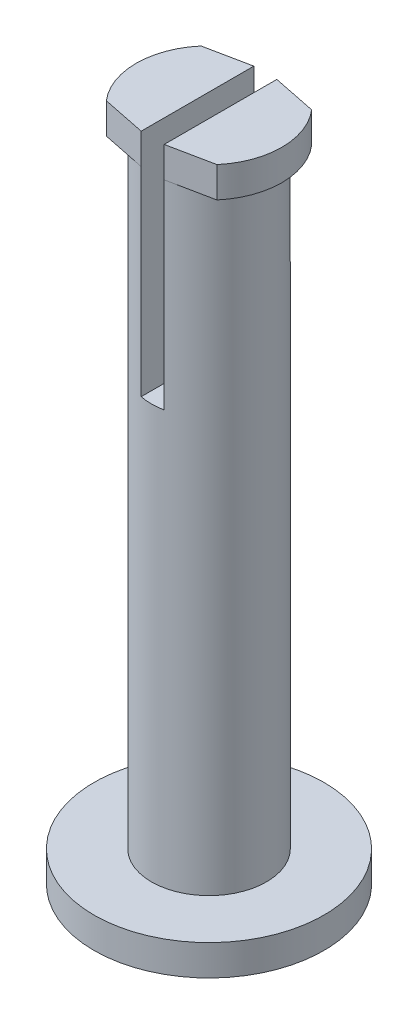
ISO-10303-21;
HEADER;
FILE_DESCRIPTION(('STEP AP214'),'2;1');
FILE_NAME('part.step','',(''),(''),'','','');
FILE_SCHEMA(('AUTOMOTIVE_DESIGN { 1 0 10303 214 1 1 1 1 }'));
ENDSEC;
DATA;
#1=APPLICATION_CONTEXT('core data for automotive mechanical design processes');
#2=APPLICATION_PROTOCOL_DEFINITION('international standard','automotive_design',2000,#1);
#3=PRODUCT_CONTEXT('',#1,'mechanical');
#4=PRODUCT('Part','Part','',(#3));
#5=PRODUCT_RELATED_PRODUCT_CATEGORY('part','',(#4));
#6=PRODUCT_DEFINITION_FORMATION('','',#4);
#7=PRODUCT_DEFINITION_CONTEXT('part definition',#1,'design');
#8=PRODUCT_DEFINITION('design','',#6,#7);
#9=PRODUCT_DEFINITION_SHAPE('','',#8);
#10=(LENGTH_UNIT() NAMED_UNIT(*) SI_UNIT(.MILLI.,.METRE.));
#11=(NAMED_UNIT(*) PLANE_ANGLE_UNIT() SI_UNIT($,.RADIAN.));
#12=(NAMED_UNIT(*) SI_UNIT($,.STERADIAN.) SOLID_ANGLE_UNIT());
#13=UNCERTAINTY_MEASURE_WITH_UNIT(LENGTH_MEASURE(1.E-05),#10,'distance_accuracy_value','');
#14=(GEOMETRIC_REPRESENTATION_CONTEXT(3) GLOBAL_UNCERTAINTY_ASSIGNED_CONTEXT((#13)) GLOBAL_UNIT_ASSIGNED_CONTEXT((#10,
#11,#12)) REPRESENTATION_CONTEXT('',''));
#15=CARTESIAN_POINT('',(0.,0.,0.));
#16=DIRECTION('',(0.,0.,1.));
#17=DIRECTION('',(1.,0.,0.));
#18=AXIS2_PLACEMENT_3D('',#15,#16,#17);
#19=CARTESIAN_POINT('',(0.,22.,0.));
#20=DIRECTION('',(0.,-1.,0.));
#21=DIRECTION('',(0.,0.,-1.));
#22=AXIS2_PLACEMENT_3D('',#19,#20,#21);
#23=CYLINDRICAL_SURFACE('',#22,2.375);
#24=CARTESIAN_POINT('',(0.,21.,0.));
#25=DIRECTION('',(0.,1.,0.));
#26=DIRECTION('',(0.,0.,1.));
#27=AXIS2_PLACEMENT_3D('',#24,#25,#26);
#28=CIRCLE('',#27,2.375);
#29=CARTESIAN_POINT('',(-1.80328568570857,21.,-1.54556971234512));
#30=VERTEX_POINT('',#29);
#31=CARTESIAN_POINT('',(-1.80328568570857,21.,1.54556971234512));
#32=VERTEX_POINT('',#31);
#33=EDGE_CURVE('E167',#30,#32,#28,.T.);
#34=ORIENTED_EDGE('',*,*,#33,.T.);
#35=DIRECTION('',(0.,1.,0.));
#36=VECTOR('',#35,1.);
#37=CARTESIAN_POINT('',(-1.80328568570857,12.,1.54556971234512));
#38=LINE('',#37,#36);
#39=CARTESIAN_POINT('',(-1.80328568570857,22.,1.54556971234512));
#40=VERTEX_POINT('',#39);
#41=EDGE_CURVE('E230',#32,#40,#38,.T.);
#42=ORIENTED_EDGE('',*,*,#41,.T.);
#43=CARTESIAN_POINT('',(0.,22.,0.));
#44=DIRECTION('',(0.,1.,0.));
#45=DIRECTION('',(0.,0.,1.));
#46=AXIS2_PLACEMENT_3D('',#43,#44,#45);
#47=CIRCLE('',#46,2.375);
#48=CARTESIAN_POINT('',(-1.80328568570857,22.,-1.54556971234512));
#49=VERTEX_POINT('',#48);
#50=EDGE_CURVE('E168',#49,#40,#47,.T.);
#51=ORIENTED_EDGE('',*,*,#50,.F.);
#52=DIRECTION('',(0.,1.,0.));
#53=VECTOR('',#52,1.);
#54=CARTESIAN_POINT('',(-1.80328568570857,12.,-1.54556971234512));
#55=LINE('',#54,#53);
#56=EDGE_CURVE('E141',#30,#49,#55,.T.);
#57=ORIENTED_EDGE('',*,*,#56,.F.);
#58=EDGE_LOOP('',(#34,#42,#51,#57));
#59=FACE_BOUND('',#58,.T.);
#60=ADVANCED_FACE('F45',(#59),#23,.T.);
#61=CARTESIAN_POINT('',(0.,22.,0.));
#62=DIRECTION('',(0.,1.,0.));
#63=DIRECTION('',(0.,0.,1.));
#64=AXIS2_PLACEMENT_3D('',#61,#62,#63);
#65=PLANE('',#64);
#66=DIRECTION('',(-0.979795897113271,0.,-0.2));
#67=VECTOR('',#66,1.);
#68=CARTESIAN_POINT('',(-0.374999999999999,22.,1.83711730708738));
#69=LINE('',#68,#67);
#70=CARTESIAN_POINT('',(-0.375,22.,1.83711730708738));
#71=VERTEX_POINT('',#70);
#72=EDGE_CURVE('E233',#71,#40,#69,.T.);
#73=ORIENTED_EDGE('',*,*,#72,.F.);
#74=DIRECTION('',(0.,0.,1.));
#75=VECTOR('',#74,1.);
#76=CARTESIAN_POINT('',(-0.375,22.,4.));
#77=LINE('',#76,#75);
#78=CARTESIAN_POINT('',(-0.375,22.,-1.83711730708738));
#79=VERTEX_POINT('',#78);
#80=EDGE_CURVE('E146',#79,#71,#77,.T.);
#81=ORIENTED_EDGE('',*,*,#80,.F.);
#82=DIRECTION('',(-0.979795897113271,0.,0.2));
#83=VECTOR('',#82,1.);
#84=CARTESIAN_POINT('',(-0.374999999999999,22.,-1.83711730708738));
#85=LINE('',#84,#83);
#86=EDGE_CURVE('E60',#79,#49,#85,.T.);
#87=ORIENTED_EDGE('',*,*,#86,.T.);
#88=ORIENTED_EDGE('',*,*,#50,.T.);
#89=EDGE_LOOP('',(#73,#81,#87,#88));
#90=FACE_BOUND('',#89,.T.);
#91=ADVANCED_FACE('F250',(#90),#65,.T.);
#92=CARTESIAN_POINT('',(0.,21.,0.));
#93=DIRECTION('',(0.,1.,0.));
#94=DIRECTION('',(0.,0.,1.));
#95=AXIS2_PLACEMENT_3D('',#92,#93,#94);
#96=PLANE('',#95);
#97=CARTESIAN_POINT('',(0.,21.,0.));
#98=DIRECTION('',(0.,1.,0.));
#99=DIRECTION('',(0.,0.,1.));
#100=AXIS2_PLACEMENT_3D('',#97,#98,#99);
#101=CIRCLE('',#100,1.875);
#102=CARTESIAN_POINT('',(-0.375,21.,-1.83711730708738));
#103=VERTEX_POINT('',#102);
#104=CARTESIAN_POINT('',(-0.375,21.,1.83711730708738));
#105=VERTEX_POINT('',#104);
#106=EDGE_CURVE('E178',#103,#105,#101,.T.);
#107=ORIENTED_EDGE('',*,*,#106,.T.);
#108=DIRECTION('',(-0.979795897113271,0.,-0.2));
#109=VECTOR('',#108,1.);
#110=CARTESIAN_POINT('',(-0.374999999999999,21.,1.83711730708738));
#111=LINE('',#110,#109);
#112=EDGE_CURVE('E152',#105,#32,#111,.T.);
#113=ORIENTED_EDGE('',*,*,#112,.T.);
#114=ORIENTED_EDGE('',*,*,#33,.F.);
#115=DIRECTION('',(-0.979795897113271,0.,0.2));
#116=VECTOR('',#115,1.);
#117=CARTESIAN_POINT('',(-0.374999999999999,21.,-1.83711730708738));
#118=LINE('',#117,#116);
#119=EDGE_CURVE('E192',#103,#30,#118,.T.);
#120=ORIENTED_EDGE('',*,*,#119,.F.);
#121=EDGE_LOOP('',(#107,#113,#114,#120));
#122=FACE_BOUND('',#121,.T.);
#123=ADVANCED_FACE('F200',(#122),#96,.F.);
#124=CARTESIAN_POINT('',(1.80328568570857,21.,1.54556971234512));
#125=VERTEX_POINT('',#124);
#126=CARTESIAN_POINT('',(1.80328568570857,21.,-1.54556971234512));
#127=VERTEX_POINT('',#126);
#128=EDGE_CURVE('E171',#125,#127,#28,.T.);
#129=ORIENTED_EDGE('',*,*,#128,.T.);
#130=DIRECTION('',(0.,1.,0.));
#131=VECTOR('',#130,1.);
#132=CARTESIAN_POINT('',(1.80328568570857,12.,-1.54556971234512));
#133=LINE('',#132,#131);
#134=CARTESIAN_POINT('',(1.80328568570857,22.,-1.54556971234512));
#135=VERTEX_POINT('',#134);
#136=EDGE_CURVE('E140',#127,#135,#133,.T.);
#137=ORIENTED_EDGE('',*,*,#136,.T.);
#138=CARTESIAN_POINT('',(1.80328568570857,22.,1.54556971234512));
#139=VERTEX_POINT('',#138);
#140=EDGE_CURVE('E139',#139,#135,#47,.T.);
#141=ORIENTED_EDGE('',*,*,#140,.F.);
#142=DIRECTION('',(0.,1.,0.));
#143=VECTOR('',#142,1.);
#144=CARTESIAN_POINT('',(1.80328568570857,12.,1.54556971234512));
#145=LINE('',#144,#143);
#146=EDGE_CURVE('E223',#125,#139,#145,.T.);
#147=ORIENTED_EDGE('',*,*,#146,.F.);
#148=EDGE_LOOP('',(#129,#137,#141,#147));
#149=FACE_BOUND('',#148,.T.);
#150=ADVANCED_FACE('F238',(#149),#23,.T.);
#151=DIRECTION('',(0.979795897113271,0.,0.2));
#152=VECTOR('',#151,1.);
#153=CARTESIAN_POINT('',(0.375,22.,-1.83711730708738));
#154=LINE('',#153,#152);
#155=CARTESIAN_POINT('',(0.375,22.,-1.83711730708738));
#156=VERTEX_POINT('',#155);
#157=EDGE_CURVE('E124',#156,#135,#154,.T.);
#158=ORIENTED_EDGE('',*,*,#157,.F.);
#159=DIRECTION('',(0.,0.,-1.));
#160=VECTOR('',#159,1.);
#161=CARTESIAN_POINT('',(0.375,22.,4.));
#162=LINE('',#161,#160);
#163=CARTESIAN_POINT('',(0.375,22.,1.83711730708738));
#164=VERTEX_POINT('',#163);
#165=EDGE_CURVE('E137',#164,#156,#162,.T.);
#166=ORIENTED_EDGE('',*,*,#165,.F.);
#167=DIRECTION('',(0.979795897113271,0.,-0.2));
#168=VECTOR('',#167,1.);
#169=CARTESIAN_POINT('',(0.375,22.,1.83711730708738));
#170=LINE('',#169,#168);
#171=EDGE_CURVE('E68',#164,#139,#170,.T.);
#172=ORIENTED_EDGE('',*,*,#171,.T.);
#173=ORIENTED_EDGE('',*,*,#140,.T.);
#174=EDGE_LOOP('',(#158,#166,#172,#173));
#175=FACE_BOUND('',#174,.T.);
#176=ADVANCED_FACE('F136',(#175),#65,.T.);
#177=CARTESIAN_POINT('',(0.375,21.,1.83711730708738));
#178=VERTEX_POINT('',#177);
#179=CARTESIAN_POINT('',(0.375,21.,-1.83711730708738));
#180=VERTEX_POINT('',#179);
#181=EDGE_CURVE('E174',#178,#180,#101,.T.);
#182=ORIENTED_EDGE('',*,*,#181,.T.);
#183=DIRECTION('',(0.979795897113271,0.,0.2));
#184=VECTOR('',#183,1.);
#185=CARTESIAN_POINT('',(0.375,21.,-1.83711730708738));
#186=LINE('',#185,#184);
#187=EDGE_CURVE('E127',#180,#127,#186,.T.);
#188=ORIENTED_EDGE('',*,*,#187,.T.);
#189=ORIENTED_EDGE('',*,*,#128,.F.);
#190=DIRECTION('',(0.979795897113271,0.,-0.2));
#191=VECTOR('',#190,1.);
#192=CARTESIAN_POINT('',(0.375,21.,1.83711730708738));
#193=LINE('',#192,#191);
#194=EDGE_CURVE('E221',#178,#125,#193,.T.);
#195=ORIENTED_EDGE('',*,*,#194,.F.);
#196=EDGE_LOOP('',(#182,#188,#189,#195));
#197=FACE_BOUND('',#196,.T.);
#198=ADVANCED_FACE('F218',(#197),#96,.F.);
#199=CARTESIAN_POINT('',(-0.375,14.5,4.));
#200=DIRECTION('',(-1.,0.,0.));
#201=DIRECTION('',(0.,0.,1.));
#202=AXIS2_PLACEMENT_3D('',#199,#200,#201);
#203=PLANE('',#202);
#204=ORIENTED_EDGE('',*,*,#80,.T.);
#205=DIRECTION('',(0.,-1.,0.));
#206=VECTOR('',#205,1.);
#207=CARTESIAN_POINT('',(-0.375,14.5,1.83711730708738));
#208=LINE('',#207,#206);
#209=EDGE_CURVE('E13',#71,#105,#208,.T.);
#210=ORIENTED_EDGE('',*,*,#209,.T.);
#211=DIRECTION('',(0.,-1.,0.));
#212=VECTOR('',#211,1.);
#213=CARTESIAN_POINT('',(-0.375,21.,1.83711730708738));
#214=LINE('',#213,#212);
#215=CARTESIAN_POINT('',(-0.375,14.5,1.83711730708738));
#216=VERTEX_POINT('',#215);
#217=EDGE_CURVE('E161',#216,#105,#214,.F.);
#218=ORIENTED_EDGE('',*,*,#217,.F.);
#219=DIRECTION('',(0.,0.,1.));
#220=VECTOR('',#219,1.);
#221=CARTESIAN_POINT('',(-0.375,14.5,4.));
#222=LINE('',#221,#220);
#223=CARTESIAN_POINT('',(-0.375,14.5,-1.83711730708738));
#224=VERTEX_POINT('',#223);
#225=EDGE_CURVE('E145',#224,#216,#222,.T.);
#226=ORIENTED_EDGE('',*,*,#225,.F.);
#227=DIRECTION('',(0.,-1.,0.));
#228=VECTOR('',#227,1.);
#229=CARTESIAN_POINT('',(-0.375,21.,-1.83711730708738));
#230=LINE('',#229,#228);
#231=EDGE_CURVE('E164',#103,#224,#230,.T.);
#232=ORIENTED_EDGE('',*,*,#231,.F.);
#233=DIRECTION('',(0.,-1.,0.));
#234=VECTOR('',#233,1.);
#235=CARTESIAN_POINT('',(-0.375,14.5,-1.83711730708738));
#236=LINE('',#235,#234);
#237=EDGE_CURVE('E53',#79,#103,#236,.T.);
#238=ORIENTED_EDGE('',*,*,#237,.F.);
#239=EDGE_LOOP('',(#204,#210,#218,#226,#232,#238));
#240=FACE_BOUND('',#239,.T.);
#241=ADVANCED_FACE('F205',(#240),#203,.F.);
#242=CARTESIAN_POINT('',(0.375,14.5,4.));
#243=DIRECTION('',(1.,0.,0.));
#244=DIRECTION('',(0.,0.,-1.));
#245=AXIS2_PLACEMENT_3D('',#242,#243,#244);
#246=PLANE('',#245);
#247=ORIENTED_EDGE('',*,*,#165,.T.);
#248=DIRECTION('',(0.,-1.,0.));
#249=VECTOR('',#248,1.);
#250=CARTESIAN_POINT('',(0.375,14.5,-1.83711730708738));
#251=LINE('',#250,#249);
#252=EDGE_CURVE('E121',#156,#180,#251,.T.);
#253=ORIENTED_EDGE('',*,*,#252,.T.);
#254=DIRECTION('',(0.,-1.,0.));
#255=VECTOR('',#254,1.);
#256=CARTESIAN_POINT('',(0.375,21.,-1.83711730708738));
#257=LINE('',#256,#255);
#258=CARTESIAN_POINT('',(0.375,14.5,-1.83711730708738));
#259=VERTEX_POINT('',#258);
#260=EDGE_CURVE('E156',#259,#180,#257,.F.);
#261=ORIENTED_EDGE('',*,*,#260,.F.);
#262=DIRECTION('',(0.,0.,-1.));
#263=VECTOR('',#262,1.);
#264=CARTESIAN_POINT('',(0.375,14.5,4.));
#265=LINE('',#264,#263);
#266=CARTESIAN_POINT('',(0.375,14.5,1.83711730708738));
#267=VERTEX_POINT('',#266);
#268=EDGE_CURVE('E149',#267,#259,#265,.T.);
#269=ORIENTED_EDGE('',*,*,#268,.F.);
#270=DIRECTION('',(0.,-1.,0.));
#271=VECTOR('',#270,1.);
#272=CARTESIAN_POINT('',(0.375,21.,1.83711730708738));
#273=LINE('',#272,#271);
#274=EDGE_CURVE('E158',#178,#267,#273,.T.);
#275=ORIENTED_EDGE('',*,*,#274,.F.);
#276=DIRECTION('',(0.,-1.,0.));
#277=VECTOR('',#276,1.);
#278=CARTESIAN_POINT('',(0.375,14.5,1.83711730708738));
#279=LINE('',#278,#277);
#280=EDGE_CURVE('E131',#164,#178,#279,.T.);
#281=ORIENTED_EDGE('',*,*,#280,.F.);
#282=EDGE_LOOP('',(#247,#253,#261,#269,#275,#281));
#283=FACE_BOUND('',#282,.T.);
#284=ADVANCED_FACE('F143',(#283),#246,.F.);
#285=CARTESIAN_POINT('',(0.,1.,0.));
#286=DIRECTION('',(0.,-1.,0.));
#287=DIRECTION('',(0.,0.,-1.));
#288=AXIS2_PLACEMENT_3D('',#285,#286,#287);
#289=CYLINDRICAL_SURFACE('',#288,3.75);
#290=CARTESIAN_POINT('',(0.,1.,0.));
#291=DIRECTION('',(0.,1.,0.));
#292=DIRECTION('',(0.,0.,1.));
#293=AXIS2_PLACEMENT_3D('',#290,#291,#292);
#294=CIRCLE('',#293,3.75);
#295=CARTESIAN_POINT('',(0.,1.,3.75));
#296=VERTEX_POINT('',#295);
#297=EDGE_CURVE('E183',#296,#296,#294,.T.);
#298=ORIENTED_EDGE('',*,*,#297,.F.);
#299=EDGE_LOOP('',(#298));
#300=FACE_BOUND('',#299,.T.);
#301=CARTESIAN_POINT('',(0.,0.,0.));
#302=DIRECTION('',(0.,1.,0.));
#303=DIRECTION('',(0.,0.,1.));
#304=AXIS2_PLACEMENT_3D('',#301,#302,#303);
#305=CIRCLE('',#304,3.75);
#306=CARTESIAN_POINT('',(0.,0.,3.75));
#307=VERTEX_POINT('',#306);
#308=EDGE_CURVE('E177',#307,#307,#305,.T.);
#309=ORIENTED_EDGE('',*,*,#308,.T.);
#310=EDGE_LOOP('',(#309));
#311=FACE_BOUND('',#310,.T.);
#312=ADVANCED_FACE('F47',(#300,#311),#289,.T.);
#313=CARTESIAN_POINT('',(0.,1.,0.));
#314=DIRECTION('',(0.,1.,0.));
#315=DIRECTION('',(0.,0.,1.));
#316=AXIS2_PLACEMENT_3D('',#313,#314,#315);
#317=PLANE('',#316);
#318=CARTESIAN_POINT('',(0.,1.,0.));
#319=DIRECTION('',(0.,1.,0.));
#320=DIRECTION('',(0.,0.,1.));
#321=AXIS2_PLACEMENT_3D('',#318,#319,#320);
#322=CIRCLE('',#321,1.875);
#323=CARTESIAN_POINT('',(0.,1.,1.875));
#324=VERTEX_POINT('',#323);
#325=EDGE_CURVE('E179',#324,#324,#322,.T.);
#326=ORIENTED_EDGE('',*,*,#325,.F.);
#327=EDGE_LOOP('',(#326));
#328=FACE_BOUND('',#327,.T.);
#329=ORIENTED_EDGE('',*,*,#297,.T.);
#330=EDGE_LOOP('',(#329));
#331=FACE_BOUND('',#330,.T.);
#332=ADVANCED_FACE('F279',(#328,#331),#317,.T.);
#333=CARTESIAN_POINT('',(0.,0.,0.));
#334=DIRECTION('',(0.,1.,0.));
#335=DIRECTION('',(0.,0.,1.));
#336=AXIS2_PLACEMENT_3D('',#333,#334,#335);
#337=PLANE('',#336);
#338=ORIENTED_EDGE('',*,*,#308,.F.);
#339=EDGE_LOOP('',(#338));
#340=FACE_BOUND('',#339,.T.);
#341=ADVANCED_FACE('F284',(#340),#337,.F.);
#342=CARTESIAN_POINT('',(0.,21.,0.));
#343=DIRECTION('',(0.,-1.,0.));
#344=DIRECTION('',(0.,0.,-1.));
#345=AXIS2_PLACEMENT_3D('',#342,#343,#344);
#346=CYLINDRICAL_SURFACE('',#345,1.875);
#347=ORIENTED_EDGE('',*,*,#274,.T.);
#348=CARTESIAN_POINT('',(0.,14.5,0.));
#349=DIRECTION('',(0.,1.,0.));
#350=DIRECTION('',(0.,0.,1.));
#351=AXIS2_PLACEMENT_3D('',#348,#349,#350);
#352=CIRCLE('',#351,1.875);
#353=EDGE_CURVE('E182',#216,#267,#352,.T.);
#354=ORIENTED_EDGE('',*,*,#353,.F.);
#355=ORIENTED_EDGE('',*,*,#217,.T.);
#356=ORIENTED_EDGE('',*,*,#106,.F.);
#357=ORIENTED_EDGE('',*,*,#231,.T.);
#358=EDGE_CURVE('E189',#259,#224,#352,.T.);
#359=ORIENTED_EDGE('',*,*,#358,.F.);
#360=ORIENTED_EDGE('',*,*,#260,.T.);
#361=ORIENTED_EDGE('',*,*,#181,.F.);
#362=EDGE_LOOP('',(#347,#354,#355,#356,#357,#359,#360,#361));
#363=FACE_BOUND('',#362,.T.);
#364=ORIENTED_EDGE('',*,*,#325,.T.);
#365=EDGE_LOOP('',(#364));
#366=FACE_BOUND('',#365,.T.);
#367=ADVANCED_FACE('F208',(#363,#366),#346,.T.);
#368=CARTESIAN_POINT('',(0.,14.5,0.));
#369=DIRECTION('',(0.,1.,0.));
#370=DIRECTION('',(0.,0.,1.));
#371=AXIS2_PLACEMENT_3D('',#368,#369,#370);
#372=PLANE('',#371);
#373=ORIENTED_EDGE('',*,*,#358,.T.);
#374=ORIENTED_EDGE('',*,*,#225,.T.);
#375=ORIENTED_EDGE('',*,*,#353,.T.);
#376=ORIENTED_EDGE('',*,*,#268,.T.);
#377=EDGE_LOOP('',(#373,#374,#375,#376));
#378=FACE_BOUND('',#377,.T.);
#379=ADVANCED_FACE('F212',(#378),#372,.T.);
#380=CARTESIAN_POINT('',(0.375,12.,1.83711730708738));
#381=DIRECTION('',(0.2,0.,0.979795897113271));
#382=DIRECTION('',(0.979795897113271,0.,-0.2));
#383=AXIS2_PLACEMENT_3D('',#380,#381,#382);
#384=PLANE('',#383);
#385=ORIENTED_EDGE('',*,*,#194,.T.);
#386=ORIENTED_EDGE('',*,*,#146,.T.);
#387=ORIENTED_EDGE('',*,*,#171,.F.);
#388=ORIENTED_EDGE('',*,*,#280,.T.);
#389=EDGE_LOOP('',(#385,#386,#387,#388));
#390=FACE_BOUND('',#389,.T.);
#391=ADVANCED_FACE('F239',(#390),#384,.T.);
#392=CARTESIAN_POINT('',(0.375,12.,-1.83711730708738));
#393=DIRECTION('',(-0.2,0.,0.979795897113271));
#394=DIRECTION('',(0.979795897113271,0.,0.2));
#395=AXIS2_PLACEMENT_3D('',#392,#393,#394);
#396=PLANE('',#395);
#397=ORIENTED_EDGE('',*,*,#252,.F.);
#398=ORIENTED_EDGE('',*,*,#157,.T.);
#399=ORIENTED_EDGE('',*,*,#136,.F.);
#400=ORIENTED_EDGE('',*,*,#187,.F.);
#401=EDGE_LOOP('',(#397,#398,#399,#400));
#402=FACE_BOUND('',#401,.T.);
#403=ADVANCED_FACE('F123',(#402),#396,.F.);
#404=CARTESIAN_POINT('',(-0.374999999999999,12.,-1.83711730708738));
#405=DIRECTION('',(-0.2,0.,-0.979795897113271));
#406=DIRECTION('',(-0.979795897113271,0.,0.2));
#407=AXIS2_PLACEMENT_3D('',#404,#405,#406);
#408=PLANE('',#407);
#409=ORIENTED_EDGE('',*,*,#119,.T.);
#410=ORIENTED_EDGE('',*,*,#56,.T.);
#411=ORIENTED_EDGE('',*,*,#86,.F.);
#412=ORIENTED_EDGE('',*,*,#237,.T.);
#413=EDGE_LOOP('',(#409,#410,#411,#412));
#414=FACE_BOUND('',#413,.T.);
#415=ADVANCED_FACE('F191',(#414),#408,.T.);
#416=CARTESIAN_POINT('',(-0.374999999999999,12.,1.83711730708738));
#417=DIRECTION('',(0.2,0.,-0.979795897113271));
#418=DIRECTION('',(-0.979795897113271,0.,-0.2));
#419=AXIS2_PLACEMENT_3D('',#416,#417,#418);
#420=PLANE('',#419);
#421=ORIENTED_EDGE('',*,*,#209,.F.);
#422=ORIENTED_EDGE('',*,*,#72,.T.);
#423=ORIENTED_EDGE('',*,*,#41,.F.);
#424=ORIENTED_EDGE('',*,*,#112,.F.);
#425=EDGE_LOOP('',(#421,#422,#423,#424));
#426=FACE_BOUND('',#425,.T.);
#427=ADVANCED_FACE('F359',(#426),#420,.F.);
#428=CLOSED_SHELL('',(#60,#91,#123,#150,#176,#198,#241,#284,#312,#332,#341,#367,#379,#391,#403,
#415,#427));
#429=MANIFOLD_SOLID_BREP('B2',#428);
#430=ADVANCED_BREP_SHAPE_REPRESENTATION('',(#18,#429),#14);
#431=SHAPE_DEFINITION_REPRESENTATION(#9,#430);
ENDSEC;
END-ISO-10303-21;
